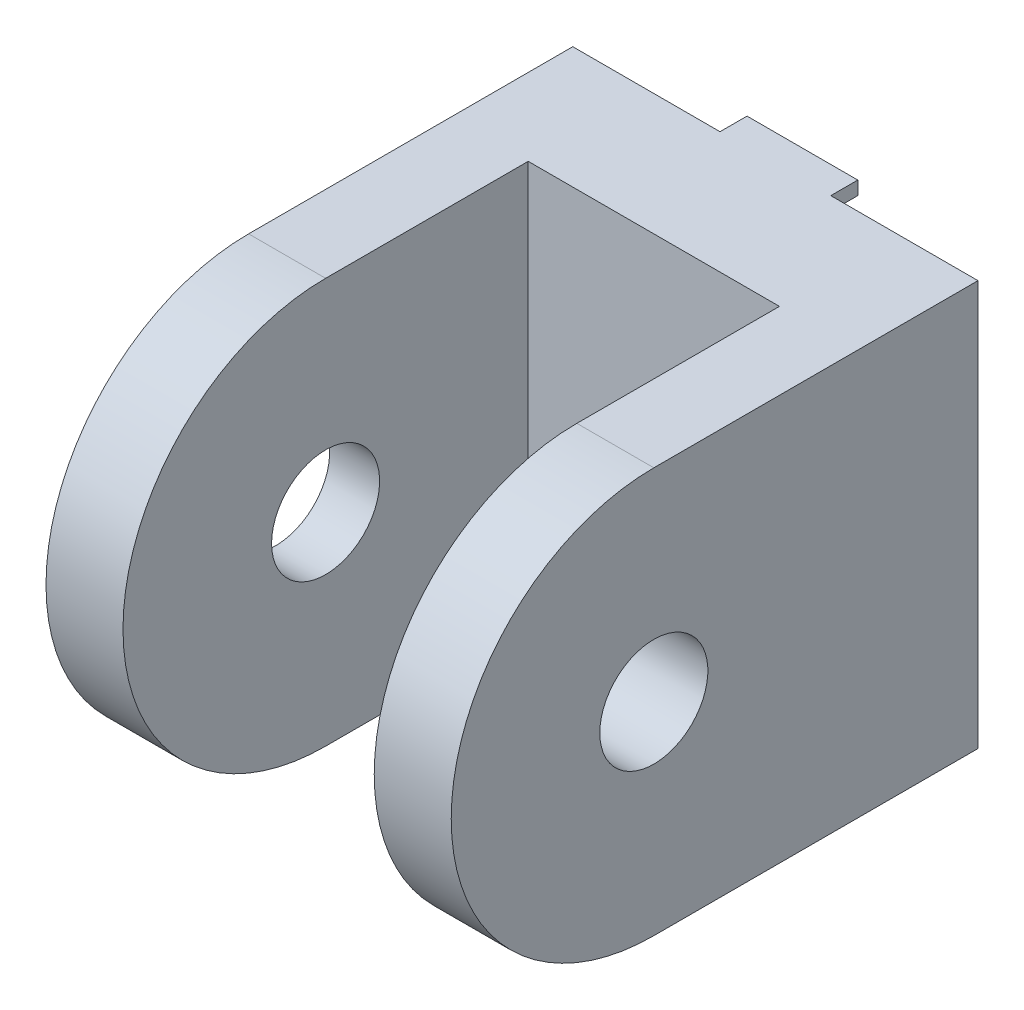
ISO-10303-21;
HEADER;
FILE_DESCRIPTION(('STEP AP214'),'2;1');
FILE_NAME('part.step','',(''),(''),'','','');
FILE_SCHEMA(('AUTOMOTIVE_DESIGN { 1 0 10303 214 1 1 1 1 }'));
ENDSEC;
DATA;
#1=APPLICATION_CONTEXT('core data for automotive mechanical design processes');
#2=APPLICATION_PROTOCOL_DEFINITION('international standard','automotive_design',2000,#1);
#3=PRODUCT_CONTEXT('',#1,'mechanical');
#4=PRODUCT('Part','Part','',(#3));
#5=PRODUCT_RELATED_PRODUCT_CATEGORY('part','',(#4));
#6=PRODUCT_DEFINITION_FORMATION('','',#4);
#7=PRODUCT_DEFINITION_CONTEXT('part definition',#1,'design');
#8=PRODUCT_DEFINITION('design','',#6,#7);
#9=PRODUCT_DEFINITION_SHAPE('','',#8);
#10=(LENGTH_UNIT() NAMED_UNIT(*) SI_UNIT(.MILLI.,.METRE.));
#11=(NAMED_UNIT(*) PLANE_ANGLE_UNIT() SI_UNIT($,.RADIAN.));
#12=(NAMED_UNIT(*) SI_UNIT($,.STERADIAN.) SOLID_ANGLE_UNIT());
#13=UNCERTAINTY_MEASURE_WITH_UNIT(LENGTH_MEASURE(1.E-05),#10,'distance_accuracy_value','');
#14=(GEOMETRIC_REPRESENTATION_CONTEXT(3) GLOBAL_UNCERTAINTY_ASSIGNED_CONTEXT((#13)) GLOBAL_UNIT_ASSIGNED_CONTEXT((#10,
#11,#12)) REPRESENTATION_CONTEXT('',''));
#15=CARTESIAN_POINT('',(0.,0.,0.));
#16=DIRECTION('',(0.,0.,1.));
#17=DIRECTION('',(1.,0.,0.));
#18=AXIS2_PLACEMENT_3D('',#15,#16,#17);
#19=CARTESIAN_POINT('',(15.,15.,0.));
#20=DIRECTION('',(0.,0.,-1.));
#21=DIRECTION('',(-1.,0.,0.));
#22=AXIS2_PLACEMENT_3D('',#19,#20,#21);
#23=PLANE('',#22);
#24=CARTESIAN_POINT('',(0.,0.,0.));
#25=DIRECTION('',(0.,0.,1.));
#26=DIRECTION('',(1.,0.,0.));
#27=AXIS2_PLACEMENT_3D('',#24,#25,#26);
#28=CIRCLE('',#27,4.);
#29=CARTESIAN_POINT('',(4.,0.,0.));
#30=VERTEX_POINT('',#29);
#31=EDGE_CURVE('E277',#30,#30,#28,.T.);
#32=ORIENTED_EDGE('',*,*,#31,.T.);
#33=EDGE_LOOP('',(#32));
#34=FACE_BOUND('',#33,.T.);
#35=DIRECTION('',(1.,0.,0.));
#36=VECTOR('',#35,1.);
#37=CARTESIAN_POINT('',(4.1,-14.,0.));
#38=LINE('',#37,#36);
#39=CARTESIAN_POINT('',(-4.1,-14.,0.));
#40=VERTEX_POINT('',#39);
#41=CARTESIAN_POINT('',(4.1,-14.,0.));
#42=VERTEX_POINT('',#41);
#43=EDGE_CURVE('E338',#40,#42,#38,.T.);
#44=ORIENTED_EDGE('',*,*,#43,.F.);
#45=DIRECTION('',(0.,1.,0.));
#46=VECTOR('',#45,1.);
#47=CARTESIAN_POINT('',(-4.1,-15.,0.));
#48=LINE('',#47,#46);
#49=CARTESIAN_POINT('',(-4.1,-15.,0.));
#50=VERTEX_POINT('',#49);
#51=EDGE_CURVE('E336',#50,#40,#48,.T.);
#52=ORIENTED_EDGE('',*,*,#51,.F.);
#53=DIRECTION('',(1.,0.,0.));
#54=VECTOR('',#53,1.);
#55=CARTESIAN_POINT('',(-15.,-15.,0.));
#56=LINE('',#55,#54);
#57=CARTESIAN_POINT('',(-15.,-15.,0.));
#58=VERTEX_POINT('',#57);
#59=EDGE_CURVE('E172',#58,#50,#56,.T.);
#60=ORIENTED_EDGE('',*,*,#59,.F.);
#61=DIRECTION('',(0.,-1.,0.));
#62=VECTOR('',#61,1.);
#63=CARTESIAN_POINT('',(-15.,-15.,0.));
#64=LINE('',#63,#62);
#65=CARTESIAN_POINT('',(-15.,15.,0.));
#66=VERTEX_POINT('',#65);
#67=EDGE_CURVE('E225',#66,#58,#64,.T.);
#68=ORIENTED_EDGE('',*,*,#67,.F.);
#69=DIRECTION('',(-1.,0.,0.));
#70=VECTOR('',#69,1.);
#71=CARTESIAN_POINT('',(-15.,15.,0.));
#72=LINE('',#71,#70);
#73=CARTESIAN_POINT('',(-4.1,15.,0.));
#74=VERTEX_POINT('',#73);
#75=EDGE_CURVE('E215',#74,#66,#72,.T.);
#76=ORIENTED_EDGE('',*,*,#75,.F.);
#77=DIRECTION('',(0.,1.,0.));
#78=VECTOR('',#77,1.);
#79=CARTESIAN_POINT('',(-4.1,15.,0.));
#80=LINE('',#79,#78);
#81=CARTESIAN_POINT('',(-4.1,14.,0.));
#82=VERTEX_POINT('',#81);
#83=EDGE_CURVE('E184',#82,#74,#80,.T.);
#84=ORIENTED_EDGE('',*,*,#83,.F.);
#85=DIRECTION('',(-1.,0.,0.));
#86=VECTOR('',#85,1.);
#87=CARTESIAN_POINT('',(4.1,14.,0.));
#88=LINE('',#87,#86);
#89=CARTESIAN_POINT('',(4.1,14.,0.));
#90=VERTEX_POINT('',#89);
#91=EDGE_CURVE('E58',#90,#82,#88,.T.);
#92=ORIENTED_EDGE('',*,*,#91,.F.);
#93=DIRECTION('',(0.,-1.,0.));
#94=VECTOR('',#93,1.);
#95=CARTESIAN_POINT('',(4.1,15.,0.));
#96=LINE('',#95,#94);
#97=CARTESIAN_POINT('',(4.1,15.,0.));
#98=VERTEX_POINT('',#97);
#99=EDGE_CURVE('E173',#98,#90,#96,.T.);
#100=ORIENTED_EDGE('',*,*,#99,.F.);
#101=CARTESIAN_POINT('',(15.,15.,0.));
#102=VERTEX_POINT('',#101);
#103=EDGE_CURVE('E218',#102,#98,#72,.T.);
#104=ORIENTED_EDGE('',*,*,#103,.F.);
#105=DIRECTION('',(0.,1.,0.));
#106=VECTOR('',#105,1.);
#107=CARTESIAN_POINT('',(15.,-15.,0.));
#108=LINE('',#107,#106);
#109=CARTESIAN_POINT('',(15.,-15.,0.));
#110=VERTEX_POINT('',#109);
#111=EDGE_CURVE('E219',#110,#102,#108,.T.);
#112=ORIENTED_EDGE('',*,*,#111,.F.);
#113=CARTESIAN_POINT('',(4.1,-15.,0.));
#114=VERTEX_POINT('',#113);
#115=EDGE_CURVE('E229',#114,#110,#56,.T.);
#116=ORIENTED_EDGE('',*,*,#115,.F.);
#117=DIRECTION('',(0.,-1.,0.));
#118=VECTOR('',#117,1.);
#119=CARTESIAN_POINT('',(4.1,-15.,0.));
#120=LINE('',#119,#118);
#121=EDGE_CURVE('E166',#42,#114,#120,.T.);
#122=ORIENTED_EDGE('',*,*,#121,.F.);
#123=EDGE_LOOP('',(#44,#52,#60,#68,#76,#84,#92,#100,#104,#112,#116,#122));
#124=FACE_BOUND('',#123,.T.);
#125=ADVANCED_FACE('F33',(#34,#124),#23,.T.);
#126=CARTESIAN_POINT('',(15.,0.,24.));
#127=DIRECTION('',(-1.,0.,0.));
#128=DIRECTION('',(0.,0.,1.));
#129=AXIS2_PLACEMENT_3D('',#126,#127,#128);
#130=CYLINDRICAL_SURFACE('',#129,4.00000000000001);
#131=CARTESIAN_POINT('',(-9.3,0.,24.));
#132=DIRECTION('',(-1.,0.,0.));
#133=DIRECTION('',(0.,0.,1.));
#134=AXIS2_PLACEMENT_3D('',#131,#132,#133);
#135=CIRCLE('',#134,4.00000000000001);
#136=CARTESIAN_POINT('',(-9.3,0.,28.));
#137=VERTEX_POINT('',#136);
#138=EDGE_CURVE('E262',#137,#137,#135,.T.);
#139=ORIENTED_EDGE('',*,*,#138,.F.);
#140=EDGE_LOOP('',(#139));
#141=FACE_BOUND('',#140,.T.);
#142=CARTESIAN_POINT('',(-13.,0.,24.));
#143=DIRECTION('',(-1.,0.,0.));
#144=DIRECTION('',(0.,0.,1.));
#145=AXIS2_PLACEMENT_3D('',#142,#143,#144);
#146=CIRCLE('',#145,4.00000000000001);
#147=CARTESIAN_POINT('',(-13.,0.,28.));
#148=VERTEX_POINT('',#147);
#149=EDGE_CURVE('E264',#148,#148,#146,.F.);
#150=ORIENTED_EDGE('',*,*,#149,.F.);
#151=EDGE_LOOP('',(#150));
#152=FACE_BOUND('',#151,.T.);
#153=ADVANCED_FACE('F380',(#141,#152),#130,.F.);
#154=CARTESIAN_POINT('',(-15.,15.,9.));
#155=DIRECTION('',(0.,-1.,0.));
#156=DIRECTION('',(0.,0.,-1.));
#157=AXIS2_PLACEMENT_3D('',#154,#155,#156);
#158=PLANE('',#157);
#159=DIRECTION('',(1.,0.,0.));
#160=VECTOR('',#159,1.);
#161=CARTESIAN_POINT('',(-117.410233892114,15.,24.));
#162=LINE('',#161,#160);
#163=CARTESIAN_POINT('',(9.3,15.,24.));
#164=VERTEX_POINT('',#163);
#165=CARTESIAN_POINT('',(15.,15.,24.));
#166=VERTEX_POINT('',#165);
#167=EDGE_CURVE('E286',#164,#166,#162,.T.);
#168=ORIENTED_EDGE('',*,*,#167,.T.);
#169=DIRECTION('',(0.,0.,-1.));
#170=VECTOR('',#169,1.);
#171=CARTESIAN_POINT('',(15.,15.,9.));
#172=LINE('',#171,#170);
#173=EDGE_CURVE('E11',#166,#102,#172,.T.);
#174=ORIENTED_EDGE('',*,*,#173,.T.);
#175=ORIENTED_EDGE('',*,*,#103,.T.);
#176=DIRECTION('',(0.,0.,1.));
#177=VECTOR('',#176,1.);
#178=CARTESIAN_POINT('',(4.1,15.,-2.));
#179=LINE('',#178,#177);
#180=CARTESIAN_POINT('',(4.1,15.,-2.));
#181=VERTEX_POINT('',#180);
#182=EDGE_CURVE('E190',#181,#98,#179,.T.);
#183=ORIENTED_EDGE('',*,*,#182,.F.);
#184=DIRECTION('',(1.,0.,0.));
#185=VECTOR('',#184,1.);
#186=CARTESIAN_POINT('',(4.1,15.,-2.));
#187=LINE('',#186,#185);
#188=CARTESIAN_POINT('',(-4.1,15.,-2.));
#189=VERTEX_POINT('',#188);
#190=EDGE_CURVE('E188',#189,#181,#187,.T.);
#191=ORIENTED_EDGE('',*,*,#190,.F.);
#192=DIRECTION('',(0.,0.,1.));
#193=VECTOR('',#192,1.);
#194=CARTESIAN_POINT('',(-4.1,15.,-2.));
#195=LINE('',#194,#193);
#196=EDGE_CURVE('E201',#189,#74,#195,.T.);
#197=ORIENTED_EDGE('',*,*,#196,.T.);
#198=ORIENTED_EDGE('',*,*,#75,.T.);
#199=DIRECTION('',(0.,0.,-1.));
#200=VECTOR('',#199,1.);
#201=CARTESIAN_POINT('',(-15.,15.,9.));
#202=LINE('',#201,#200);
#203=CARTESIAN_POINT('',(-15.,15.,24.));
#204=VERTEX_POINT('',#203);
#205=EDGE_CURVE('E42',#204,#66,#202,.T.);
#206=ORIENTED_EDGE('',*,*,#205,.F.);
#207=CARTESIAN_POINT('',(-9.3,15.,24.));
#208=VERTEX_POINT('',#207);
#209=EDGE_CURVE('E289',#204,#208,#162,.T.);
#210=ORIENTED_EDGE('',*,*,#209,.T.);
#211=DIRECTION('',(0.,0.,-1.));
#212=VECTOR('',#211,1.);
#213=CARTESIAN_POINT('',(-9.3,15.,39.));
#214=LINE('',#213,#212);
#215=CARTESIAN_POINT('',(-9.3,15.,9.));
#216=VERTEX_POINT('',#215);
#217=EDGE_CURVE('E255',#208,#216,#214,.T.);
#218=ORIENTED_EDGE('',*,*,#217,.T.);
#219=DIRECTION('',(-1.,0.,0.));
#220=VECTOR('',#219,1.);
#221=CARTESIAN_POINT('',(-15.,15.,9.));
#222=LINE('',#221,#220);
#223=CARTESIAN_POINT('',(9.3,15.,9.));
#224=VERTEX_POINT('',#223);
#225=EDGE_CURVE('E231',#224,#216,#222,.T.);
#226=ORIENTED_EDGE('',*,*,#225,.F.);
#227=DIRECTION('',(0.,0.,-1.));
#228=VECTOR('',#227,1.);
#229=CARTESIAN_POINT('',(9.3,15.,39.));
#230=LINE('',#229,#228);
#231=EDGE_CURVE('E305',#164,#224,#230,.T.);
#232=ORIENTED_EDGE('',*,*,#231,.F.);
#233=EDGE_LOOP('',(#168,#174,#175,#183,#191,#197,#198,#206,#210,#218,#226,#232));
#234=FACE_BOUND('',#233,.T.);
#235=ADVANCED_FACE('F324',(#234),#158,.F.);
#236=CARTESIAN_POINT('',(15.,15.,9.));
#237=DIRECTION('',(0.,0.,-1.));
#238=DIRECTION('',(-1.,0.,0.));
#239=AXIS2_PLACEMENT_3D('',#236,#237,#238);
#240=PLANE('',#239);
#241=CARTESIAN_POINT('',(0.,0.,9.));
#242=DIRECTION('',(0.,0.,1.));
#243=DIRECTION('',(1.,0.,0.));
#244=AXIS2_PLACEMENT_3D('',#241,#242,#243);
#245=CIRCLE('',#244,4.);
#246=CARTESIAN_POINT('',(4.,0.,9.));
#247=VERTEX_POINT('',#246);
#248=EDGE_CURVE('E280',#247,#247,#245,.T.);
#249=ORIENTED_EDGE('',*,*,#248,.F.);
#250=EDGE_LOOP('',(#249));
#251=FACE_BOUND('',#250,.T.);
#252=DIRECTION('',(0.,-1.,0.));
#253=VECTOR('',#252,1.);
#254=CARTESIAN_POINT('',(9.3,-15.,9.));
#255=LINE('',#254,#253);
#256=CARTESIAN_POINT('',(9.3,-15.,9.));
#257=VERTEX_POINT('',#256);
#258=EDGE_CURVE('E301',#224,#257,#255,.T.);
#259=ORIENTED_EDGE('',*,*,#258,.F.);
#260=ORIENTED_EDGE('',*,*,#225,.T.);
#261=DIRECTION('',(0.,1.,0.));
#262=VECTOR('',#261,1.);
#263=CARTESIAN_POINT('',(-9.3,-15.,9.));
#264=LINE('',#263,#262);
#265=CARTESIAN_POINT('',(-9.3,-15.,9.));
#266=VERTEX_POINT('',#265);
#267=EDGE_CURVE('E242',#266,#216,#264,.T.);
#268=ORIENTED_EDGE('',*,*,#267,.F.);
#269=DIRECTION('',(1.,0.,0.));
#270=VECTOR('',#269,1.);
#271=CARTESIAN_POINT('',(-15.,-15.,9.));
#272=LINE('',#271,#270);
#273=EDGE_CURVE('E236',#266,#257,#272,.T.);
#274=ORIENTED_EDGE('',*,*,#273,.T.);
#275=EDGE_LOOP('',(#259,#260,#268,#274));
#276=FACE_BOUND('',#275,.T.);
#277=ADVANCED_FACE('F317',(#251,#276),#240,.F.);
#278=CARTESIAN_POINT('',(15.,-15.,9.));
#279=DIRECTION('',(-1.,0.,0.));
#280=DIRECTION('',(0.,0.,1.));
#281=AXIS2_PLACEMENT_3D('',#278,#279,#280);
#282=PLANE('',#281);
#283=CARTESIAN_POINT('',(15.,0.,24.));
#284=DIRECTION('',(-1.,0.,0.));
#285=DIRECTION('',(0.,0.,1.));
#286=AXIS2_PLACEMENT_3D('',#283,#284,#285);
#287=CIRCLE('',#286,4.00000000000001);
#288=CARTESIAN_POINT('',(15.,0.,28.));
#289=VERTEX_POINT('',#288);
#290=EDGE_CURVE('E263',#289,#289,#287,.T.);
#291=ORIENTED_EDGE('',*,*,#290,.T.);
#292=EDGE_LOOP('',(#291));
#293=FACE_BOUND('',#292,.T.);
#294=CARTESIAN_POINT('',(15.,0.,24.));
#295=DIRECTION('',(-1.,0.,0.));
#296=DIRECTION('',(0.,0.,1.));
#297=AXIS2_PLACEMENT_3D('',#294,#295,#296);
#298=CIRCLE('',#297,15.);
#299=CARTESIAN_POINT('',(15.,-15.,24.));
#300=VERTEX_POINT('',#299);
#301=EDGE_CURVE('E296',#166,#300,#298,.F.);
#302=ORIENTED_EDGE('',*,*,#301,.T.);
#303=DIRECTION('',(0.,0.,-1.));
#304=VECTOR('',#303,1.);
#305=CARTESIAN_POINT('',(15.,-15.,9.));
#306=LINE('',#305,#304);
#307=EDGE_CURVE('E232',#300,#110,#306,.T.);
#308=ORIENTED_EDGE('',*,*,#307,.T.);
#309=ORIENTED_EDGE('',*,*,#111,.T.);
#310=ORIENTED_EDGE('',*,*,#173,.F.);
#311=EDGE_LOOP('',(#302,#308,#309,#310));
#312=FACE_BOUND('',#311,.T.);
#313=ADVANCED_FACE('F35',(#293,#312),#282,.F.);
#314=CARTESIAN_POINT('',(-15.,-15.,9.));
#315=DIRECTION('',(1.,0.,0.));
#316=DIRECTION('',(0.,0.,-1.));
#317=AXIS2_PLACEMENT_3D('',#314,#315,#316);
#318=PLANE('',#317);
#319=CARTESIAN_POINT('',(-15.,0.,24.));
#320=DIRECTION('',(-1.,0.,0.));
#321=DIRECTION('',(0.,0.,1.));
#322=AXIS2_PLACEMENT_3D('',#319,#320,#321);
#323=CIRCLE('',#322,8.);
#324=CARTESIAN_POINT('',(-15.,0.,32.));
#325=VERTEX_POINT('',#324);
#326=EDGE_CURVE('E272',#325,#325,#323,.T.);
#327=ORIENTED_EDGE('',*,*,#326,.F.);
#328=EDGE_LOOP('',(#327));
#329=FACE_BOUND('',#328,.T.);
#330=DIRECTION('',(0.,0.,-1.));
#331=VECTOR('',#330,1.);
#332=CARTESIAN_POINT('',(-15.,-15.,9.));
#333=LINE('',#332,#331);
#334=CARTESIAN_POINT('',(-15.,-15.,24.));
#335=VERTEX_POINT('',#334);
#336=EDGE_CURVE('E235',#335,#58,#333,.T.);
#337=ORIENTED_EDGE('',*,*,#336,.F.);
#338=CARTESIAN_POINT('',(-15.,0.,24.));
#339=DIRECTION('',(1.,0.,0.));
#340=DIRECTION('',(0.,0.,-1.));
#341=AXIS2_PLACEMENT_3D('',#338,#339,#340);
#342=CIRCLE('',#341,15.);
#343=EDGE_CURVE('E299',#335,#204,#342,.F.);
#344=ORIENTED_EDGE('',*,*,#343,.T.);
#345=ORIENTED_EDGE('',*,*,#205,.T.);
#346=ORIENTED_EDGE('',*,*,#67,.T.);
#347=EDGE_LOOP('',(#337,#344,#345,#346));
#348=FACE_BOUND('',#347,.T.);
#349=ADVANCED_FACE('F333',(#329,#348),#318,.F.);
#350=CARTESIAN_POINT('',(-15.,-15.,9.));
#351=DIRECTION('',(0.,1.,0.));
#352=DIRECTION('',(0.,0.,1.));
#353=AXIS2_PLACEMENT_3D('',#350,#351,#352);
#354=PLANE('',#353);
#355=ORIENTED_EDGE('',*,*,#307,.F.);
#356=DIRECTION('',(1.,0.,0.));
#357=VECTOR('',#356,1.);
#358=CARTESIAN_POINT('',(-117.410233892114,-15.,24.));
#359=LINE('',#358,#357);
#360=CARTESIAN_POINT('',(9.3,-15.,24.));
#361=VERTEX_POINT('',#360);
#362=EDGE_CURVE('E285',#361,#300,#359,.T.);
#363=ORIENTED_EDGE('',*,*,#362,.F.);
#364=DIRECTION('',(0.,0.,-1.));
#365=VECTOR('',#364,1.);
#366=CARTESIAN_POINT('',(9.3,-15.,39.));
#367=LINE('',#366,#365);
#368=EDGE_CURVE('E304',#361,#257,#367,.T.);
#369=ORIENTED_EDGE('',*,*,#368,.T.);
#370=ORIENTED_EDGE('',*,*,#273,.F.);
#371=DIRECTION('',(0.,0.,-1.));
#372=VECTOR('',#371,1.);
#373=CARTESIAN_POINT('',(-9.3,-15.,39.));
#374=LINE('',#373,#372);
#375=CARTESIAN_POINT('',(-9.3,-15.,24.));
#376=VERTEX_POINT('',#375);
#377=EDGE_CURVE('E257',#376,#266,#374,.T.);
#378=ORIENTED_EDGE('',*,*,#377,.F.);
#379=EDGE_CURVE('E290',#335,#376,#359,.T.);
#380=ORIENTED_EDGE('',*,*,#379,.F.);
#381=ORIENTED_EDGE('',*,*,#336,.T.);
#382=ORIENTED_EDGE('',*,*,#59,.T.);
#383=DIRECTION('',(0.,0.,1.));
#384=VECTOR('',#383,1.);
#385=CARTESIAN_POINT('',(-4.1,-15.,-2.));
#386=LINE('',#385,#384);
#387=CARTESIAN_POINT('',(-4.1,-15.,-2.));
#388=VERTEX_POINT('',#387);
#389=EDGE_CURVE('E151',#388,#50,#386,.T.);
#390=ORIENTED_EDGE('',*,*,#389,.F.);
#391=DIRECTION('',(-1.,0.,0.));
#392=VECTOR('',#391,1.);
#393=CARTESIAN_POINT('',(4.1,-15.,-2.));
#394=LINE('',#393,#392);
#395=CARTESIAN_POINT('',(4.1,-15.,-2.));
#396=VERTEX_POINT('',#395);
#397=EDGE_CURVE('E158',#396,#388,#394,.T.);
#398=ORIENTED_EDGE('',*,*,#397,.F.);
#399=DIRECTION('',(0.,0.,1.));
#400=VECTOR('',#399,1.);
#401=CARTESIAN_POINT('',(4.1,-15.,-2.));
#402=LINE('',#401,#400);
#403=EDGE_CURVE('E345',#396,#114,#402,.T.);
#404=ORIENTED_EDGE('',*,*,#403,.T.);
#405=ORIENTED_EDGE('',*,*,#115,.T.);
#406=EDGE_LOOP('',(#355,#363,#369,#370,#378,#380,#381,#382,#390,#398,#404,#405));
#407=FACE_BOUND('',#406,.T.);
#408=ADVANCED_FACE('F170',(#407),#354,.F.);
#409=CARTESIAN_POINT('',(-9.3,-15.,39.));
#410=DIRECTION('',(-1.,0.,0.));
#411=DIRECTION('',(0.,0.,1.));
#412=AXIS2_PLACEMENT_3D('',#409,#410,#411);
#413=PLANE('',#412);
#414=ORIENTED_EDGE('',*,*,#138,.T.);
#415=EDGE_LOOP('',(#414));
#416=FACE_BOUND('',#415,.T.);
#417=CARTESIAN_POINT('',(-9.3,0.,24.));
#418=DIRECTION('',(-1.,0.,0.));
#419=DIRECTION('',(0.,0.,1.));
#420=AXIS2_PLACEMENT_3D('',#417,#418,#419);
#421=CIRCLE('',#420,15.);
#422=EDGE_CURVE('E295',#208,#376,#421,.F.);
#423=ORIENTED_EDGE('',*,*,#422,.T.);
#424=ORIENTED_EDGE('',*,*,#377,.T.);
#425=ORIENTED_EDGE('',*,*,#267,.T.);
#426=ORIENTED_EDGE('',*,*,#217,.F.);
#427=EDGE_LOOP('',(#423,#424,#425,#426));
#428=FACE_BOUND('',#427,.T.);
#429=ADVANCED_FACE('F313',(#416,#428),#413,.F.);
#430=CARTESIAN_POINT('',(9.3,-15.,39.));
#431=DIRECTION('',(1.,0.,0.));
#432=DIRECTION('',(0.,0.,-1.));
#433=AXIS2_PLACEMENT_3D('',#430,#431,#432);
#434=PLANE('',#433);
#435=CARTESIAN_POINT('',(9.3,0.,24.));
#436=DIRECTION('',(1.,0.,0.));
#437=DIRECTION('',(0.,0.,-1.));
#438=AXIS2_PLACEMENT_3D('',#435,#436,#437);
#439=CIRCLE('',#438,4.00000000000001);
#440=CARTESIAN_POINT('',(9.3,0.,20.));
#441=VERTEX_POINT('',#440);
#442=EDGE_CURVE('E260',#441,#441,#439,.T.);
#443=ORIENTED_EDGE('',*,*,#442,.T.);
#444=EDGE_LOOP('',(#443));
#445=FACE_BOUND('',#444,.T.);
#446=ORIENTED_EDGE('',*,*,#368,.F.);
#447=CARTESIAN_POINT('',(9.3,0.,24.));
#448=DIRECTION('',(1.,0.,0.));
#449=DIRECTION('',(0.,0.,-1.));
#450=AXIS2_PLACEMENT_3D('',#447,#448,#449);
#451=CIRCLE('',#450,15.);
#452=EDGE_CURVE('E293',#361,#164,#451,.F.);
#453=ORIENTED_EDGE('',*,*,#452,.T.);
#454=ORIENTED_EDGE('',*,*,#231,.T.);
#455=ORIENTED_EDGE('',*,*,#258,.T.);
#456=EDGE_LOOP('',(#446,#453,#454,#455));
#457=FACE_BOUND('',#456,.T.);
#458=ADVANCED_FACE('F322',(#445,#457),#434,.F.);
#459=CARTESIAN_POINT('',(-117.410233892114,0.,24.));
#460=DIRECTION('',(1.,0.,0.));
#461=DIRECTION('',(0.,0.,-1.));
#462=AXIS2_PLACEMENT_3D('',#459,#460,#461);
#463=CYLINDRICAL_SURFACE('',#462,15.);
#464=ORIENTED_EDGE('',*,*,#362,.T.);
#465=ORIENTED_EDGE('',*,*,#301,.F.);
#466=ORIENTED_EDGE('',*,*,#167,.F.);
#467=ORIENTED_EDGE('',*,*,#452,.F.);
#468=EDGE_LOOP('',(#464,#465,#466,#467));
#469=FACE_BOUND('',#468,.T.);
#470=ADVANCED_FACE('F356',(#469),#463,.T.);
#471=ORIENTED_EDGE('',*,*,#343,.F.);
#472=ORIENTED_EDGE('',*,*,#379,.T.);
#473=ORIENTED_EDGE('',*,*,#422,.F.);
#474=ORIENTED_EDGE('',*,*,#209,.F.);
#475=EDGE_LOOP('',(#471,#472,#473,#474));
#476=FACE_BOUND('',#475,.T.);
#477=ADVANCED_FACE('F329',(#476),#463,.T.);
#478=ORIENTED_EDGE('',*,*,#290,.F.);
#479=EDGE_LOOP('',(#478));
#480=FACE_BOUND('',#479,.T.);
#481=ORIENTED_EDGE('',*,*,#442,.F.);
#482=EDGE_LOOP('',(#481));
#483=FACE_BOUND('',#482,.T.);
#484=ADVANCED_FACE('F389',(#480,#483),#130,.F.);
#485=CARTESIAN_POINT('',(-13.,0.,24.));
#486=DIRECTION('',(-1.,0.,0.));
#487=DIRECTION('',(0.,0.,1.));
#488=AXIS2_PLACEMENT_3D('',#485,#486,#487);
#489=PLANE('',#488);
#490=CARTESIAN_POINT('',(-13.,0.,24.));
#491=DIRECTION('',(-1.,0.,0.));
#492=DIRECTION('',(0.,0.,1.));
#493=AXIS2_PLACEMENT_3D('',#490,#491,#492);
#494=CIRCLE('',#493,8.);
#495=CARTESIAN_POINT('',(-13.,0.,32.));
#496=VERTEX_POINT('',#495);
#497=EDGE_CURVE('E266',#496,#496,#494,.T.);
#498=ORIENTED_EDGE('',*,*,#497,.T.);
#499=EDGE_LOOP('',(#498));
#500=FACE_BOUND('',#499,.T.);
#501=ORIENTED_EDGE('',*,*,#149,.T.);
#502=EDGE_LOOP('',(#501));
#503=FACE_BOUND('',#502,.T.);
#504=ADVANCED_FACE('F400',(#500,#503),#489,.T.);
#505=CARTESIAN_POINT('',(-13.,0.,24.));
#506=DIRECTION('',(-1.,0.,0.));
#507=DIRECTION('',(0.,0.,1.));
#508=AXIS2_PLACEMENT_3D('',#505,#506,#507);
#509=CYLINDRICAL_SURFACE('',#508,8.);
#510=ORIENTED_EDGE('',*,*,#497,.F.);
#511=EDGE_LOOP('',(#510));
#512=FACE_BOUND('',#511,.T.);
#513=ORIENTED_EDGE('',*,*,#326,.T.);
#514=EDGE_LOOP('',(#513));
#515=FACE_BOUND('',#514,.T.);
#516=ADVANCED_FACE('F369',(#512,#515),#509,.F.);
#517=CARTESIAN_POINT('',(0.,0.,0.));
#518=DIRECTION('',(0.,0.,1.));
#519=DIRECTION('',(1.,0.,0.));
#520=AXIS2_PLACEMENT_3D('',#517,#518,#519);
#521=CYLINDRICAL_SURFACE('',#520,4.);
#522=ORIENTED_EDGE('',*,*,#31,.F.);
#523=EDGE_LOOP('',(#522));
#524=FACE_BOUND('',#523,.T.);
#525=ORIENTED_EDGE('',*,*,#248,.T.);
#526=EDGE_LOOP('',(#525));
#527=FACE_BOUND('',#526,.T.);
#528=ADVANCED_FACE('F366',(#524,#527),#521,.F.);
#529=CARTESIAN_POINT('',(4.1,15.,-2.));
#530=DIRECTION('',(-1.,0.,0.));
#531=DIRECTION('',(0.,0.,1.));
#532=AXIS2_PLACEMENT_3D('',#529,#530,#531);
#533=PLANE('',#532);
#534=ORIENTED_EDGE('',*,*,#99,.T.);
#535=DIRECTION('',(0.,0.,1.));
#536=VECTOR('',#535,1.);
#537=CARTESIAN_POINT('',(4.1,14.,-2.));
#538=LINE('',#537,#536);
#539=CARTESIAN_POINT('',(4.1,14.,-2.));
#540=VERTEX_POINT('',#539);
#541=EDGE_CURVE('E207',#540,#90,#538,.T.);
#542=ORIENTED_EDGE('',*,*,#541,.F.);
#543=DIRECTION('',(0.,-1.,0.));
#544=VECTOR('',#543,1.);
#545=CARTESIAN_POINT('',(4.1,15.,-2.));
#546=LINE('',#545,#544);
#547=EDGE_CURVE('E180',#181,#540,#546,.T.);
#548=ORIENTED_EDGE('',*,*,#547,.F.);
#549=ORIENTED_EDGE('',*,*,#182,.T.);
#550=EDGE_LOOP('',(#534,#542,#548,#549));
#551=FACE_BOUND('',#550,.T.);
#552=ADVANCED_FACE('F359',(#551),#533,.F.);
#553=CARTESIAN_POINT('',(4.1,14.,-2.));
#554=DIRECTION('',(0.,1.,0.));
#555=DIRECTION('',(0.,0.,1.));
#556=AXIS2_PLACEMENT_3D('',#553,#554,#555);
#557=PLANE('',#556);
#558=ORIENTED_EDGE('',*,*,#91,.T.);
#559=DIRECTION('',(0.,0.,1.));
#560=VECTOR('',#559,1.);
#561=CARTESIAN_POINT('',(-4.1,14.,-2.));
#562=LINE('',#561,#560);
#563=CARTESIAN_POINT('',(-4.1,14.,-2.));
#564=VERTEX_POINT('',#563);
#565=EDGE_CURVE('E194',#564,#82,#562,.T.);
#566=ORIENTED_EDGE('',*,*,#565,.F.);
#567=DIRECTION('',(-1.,0.,0.));
#568=VECTOR('',#567,1.);
#569=CARTESIAN_POINT('',(4.1,14.,-2.));
#570=LINE('',#569,#568);
#571=EDGE_CURVE('E183',#540,#564,#570,.T.);
#572=ORIENTED_EDGE('',*,*,#571,.F.);
#573=ORIENTED_EDGE('',*,*,#541,.T.);
#574=EDGE_LOOP('',(#558,#566,#572,#573));
#575=FACE_BOUND('',#574,.T.);
#576=ADVANCED_FACE('F489',(#575),#557,.F.);
#577=CARTESIAN_POINT('',(-4.1,15.,-2.));
#578=DIRECTION('',(1.,0.,0.));
#579=DIRECTION('',(0.,0.,-1.));
#580=AXIS2_PLACEMENT_3D('',#577,#578,#579);
#581=PLANE('',#580);
#582=ORIENTED_EDGE('',*,*,#83,.T.);
#583=ORIENTED_EDGE('',*,*,#196,.F.);
#584=DIRECTION('',(0.,1.,0.));
#585=VECTOR('',#584,1.);
#586=CARTESIAN_POINT('',(-4.1,15.,-2.));
#587=LINE('',#586,#585);
#588=EDGE_CURVE('E186',#564,#189,#587,.T.);
#589=ORIENTED_EDGE('',*,*,#588,.F.);
#590=ORIENTED_EDGE('',*,*,#565,.T.);
#591=EDGE_LOOP('',(#582,#583,#589,#590));
#592=FACE_BOUND('',#591,.T.);
#593=ADVANCED_FACE('F498',(#592),#581,.F.);
#594=CARTESIAN_POINT('',(4.1,14.,-2.));
#595=DIRECTION('',(0.,0.,-1.));
#596=DIRECTION('',(-1.,0.,0.));
#597=AXIS2_PLACEMENT_3D('',#594,#595,#596);
#598=PLANE('',#597);
#599=ORIENTED_EDGE('',*,*,#547,.T.);
#600=ORIENTED_EDGE('',*,*,#571,.T.);
#601=ORIENTED_EDGE('',*,*,#588,.T.);
#602=ORIENTED_EDGE('',*,*,#190,.T.);
#603=EDGE_LOOP('',(#599,#600,#601,#602));
#604=FACE_BOUND('',#603,.T.);
#605=ADVANCED_FACE('F507',(#604),#598,.T.);
#606=CARTESIAN_POINT('',(-4.1,-15.,-2.));
#607=DIRECTION('',(1.,0.,0.));
#608=DIRECTION('',(0.,0.,-1.));
#609=AXIS2_PLACEMENT_3D('',#606,#607,#608);
#610=PLANE('',#609);
#611=ORIENTED_EDGE('',*,*,#51,.T.);
#612=DIRECTION('',(0.,0.,1.));
#613=VECTOR('',#612,1.);
#614=CARTESIAN_POINT('',(-4.1,-14.,-2.));
#615=LINE('',#614,#613);
#616=CARTESIAN_POINT('',(-4.1,-14.,-2.));
#617=VERTEX_POINT('',#616);
#618=EDGE_CURVE('E154',#617,#40,#615,.T.);
#619=ORIENTED_EDGE('',*,*,#618,.F.);
#620=DIRECTION('',(0.,1.,0.));
#621=VECTOR('',#620,1.);
#622=CARTESIAN_POINT('',(-4.1,-15.,-2.));
#623=LINE('',#622,#621);
#624=EDGE_CURVE('E147',#388,#617,#623,.T.);
#625=ORIENTED_EDGE('',*,*,#624,.F.);
#626=ORIENTED_EDGE('',*,*,#389,.T.);
#627=EDGE_LOOP('',(#611,#619,#625,#626));
#628=FACE_BOUND('',#627,.T.);
#629=ADVANCED_FACE('F149',(#628),#610,.F.);
#630=CARTESIAN_POINT('',(4.1,-14.,-2.));
#631=DIRECTION('',(0.,-1.,0.));
#632=DIRECTION('',(0.,0.,-1.));
#633=AXIS2_PLACEMENT_3D('',#630,#631,#632);
#634=PLANE('',#633);
#635=ORIENTED_EDGE('',*,*,#43,.T.);
#636=DIRECTION('',(0.,0.,1.));
#637=VECTOR('',#636,1.);
#638=CARTESIAN_POINT('',(4.1,-14.,-2.));
#639=LINE('',#638,#637);
#640=CARTESIAN_POINT('',(4.1,-14.,-2.));
#641=VERTEX_POINT('',#640);
#642=EDGE_CURVE('E50',#641,#42,#639,.T.);
#643=ORIENTED_EDGE('',*,*,#642,.F.);
#644=DIRECTION('',(1.,0.,0.));
#645=VECTOR('',#644,1.);
#646=CARTESIAN_POINT('',(4.1,-14.,-2.));
#647=LINE('',#646,#645);
#648=EDGE_CURVE('E157',#617,#641,#647,.T.);
#649=ORIENTED_EDGE('',*,*,#648,.F.);
#650=ORIENTED_EDGE('',*,*,#618,.T.);
#651=EDGE_LOOP('',(#635,#643,#649,#650));
#652=FACE_BOUND('',#651,.T.);
#653=ADVANCED_FACE('F348',(#652),#634,.F.);
#654=CARTESIAN_POINT('',(4.1,-15.,-2.));
#655=DIRECTION('',(-1.,0.,0.));
#656=DIRECTION('',(0.,0.,1.));
#657=AXIS2_PLACEMENT_3D('',#654,#655,#656);
#658=PLANE('',#657);
#659=ORIENTED_EDGE('',*,*,#121,.T.);
#660=ORIENTED_EDGE('',*,*,#403,.F.);
#661=DIRECTION('',(0.,-1.,0.));
#662=VECTOR('',#661,1.);
#663=CARTESIAN_POINT('',(4.1,-15.,-2.));
#664=LINE('',#663,#662);
#665=EDGE_CURVE('E162',#641,#396,#664,.T.);
#666=ORIENTED_EDGE('',*,*,#665,.F.);
#667=ORIENTED_EDGE('',*,*,#642,.T.);
#668=EDGE_LOOP('',(#659,#660,#666,#667));
#669=FACE_BOUND('',#668,.T.);
#670=ADVANCED_FACE('F349',(#669),#658,.F.);
#671=CARTESIAN_POINT('',(-4.1,-15.,-2.));
#672=DIRECTION('',(0.,0.,-1.));
#673=DIRECTION('',(-1.,0.,0.));
#674=AXIS2_PLACEMENT_3D('',#671,#672,#673);
#675=PLANE('',#674);
#676=ORIENTED_EDGE('',*,*,#397,.T.);
#677=ORIENTED_EDGE('',*,*,#624,.T.);
#678=ORIENTED_EDGE('',*,*,#648,.T.);
#679=ORIENTED_EDGE('',*,*,#665,.T.);
#680=EDGE_LOOP('',(#676,#677,#678,#679));
#681=FACE_BOUND('',#680,.T.);
#682=ADVANCED_FACE('F161',(#681),#675,.T.);
#683=CLOSED_SHELL('',(#125,#153,#235,#277,#313,#349,#408,#429,#458,#470,#477,#484,#504,#516,
#528,#552,#576,#593,#605,#629,#653,#670,#682));
#684=MANIFOLD_SOLID_BREP('B2',#683);
#685=ADVANCED_BREP_SHAPE_REPRESENTATION('',(#18,#684),#14);
#686=SHAPE_DEFINITION_REPRESENTATION(#9,#685);
ENDSEC;
END-ISO-10303-21;
